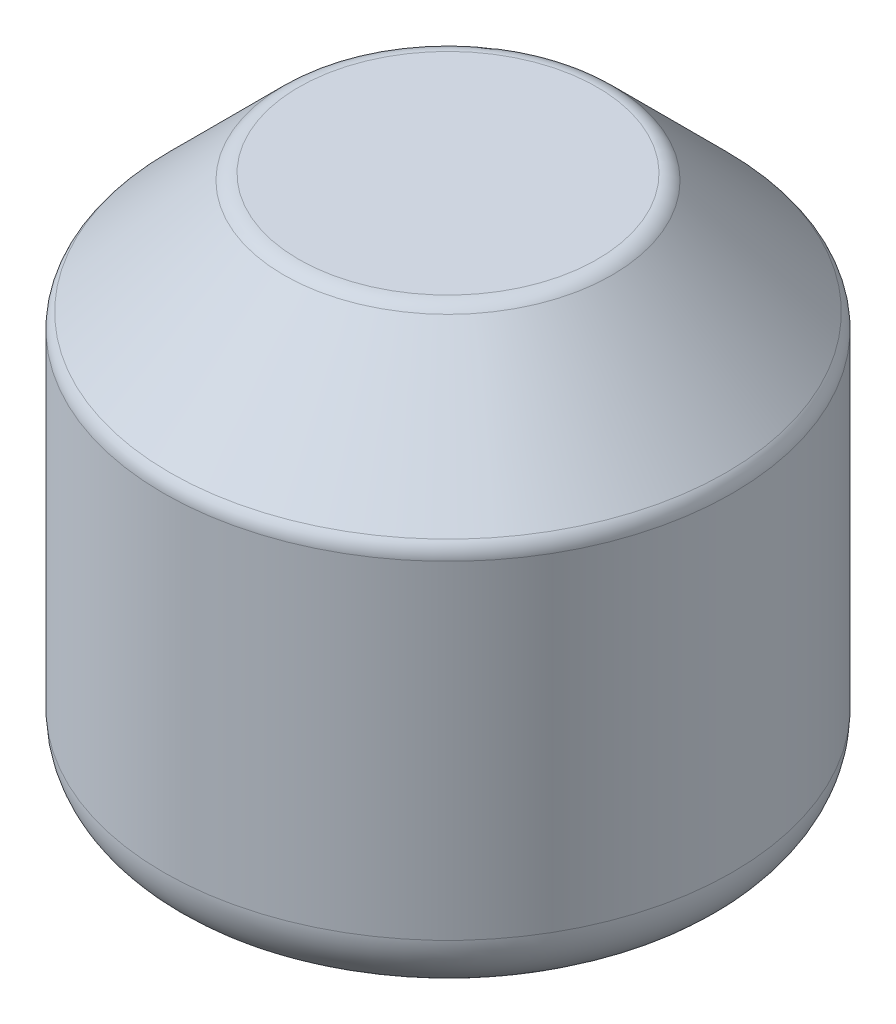
ISO-10303-21;
HEADER;
FILE_DESCRIPTION(('STEP AP214'),'2;1');
FILE_NAME('part.step','',(''),(''),'','','');
FILE_SCHEMA(('AUTOMOTIVE_DESIGN { 1 0 10303 214 1 1 1 1 }'));
ENDSEC;
DATA;
#1=APPLICATION_CONTEXT('core data for automotive mechanical design processes');
#2=APPLICATION_PROTOCOL_DEFINITION('international standard','automotive_design',2000,#1);
#3=PRODUCT_CONTEXT('',#1,'mechanical');
#4=PRODUCT('Part','Part','',(#3));
#5=PRODUCT_RELATED_PRODUCT_CATEGORY('part','',(#4));
#6=PRODUCT_DEFINITION_FORMATION('','',#4);
#7=PRODUCT_DEFINITION_CONTEXT('part definition',#1,'design');
#8=PRODUCT_DEFINITION('design','',#6,#7);
#9=PRODUCT_DEFINITION_SHAPE('','',#8);
#10=(LENGTH_UNIT() NAMED_UNIT(*) SI_UNIT(.MILLI.,.METRE.));
#11=(NAMED_UNIT(*) PLANE_ANGLE_UNIT() SI_UNIT($,.RADIAN.));
#12=(NAMED_UNIT(*) SI_UNIT($,.STERADIAN.) SOLID_ANGLE_UNIT());
#13=UNCERTAINTY_MEASURE_WITH_UNIT(LENGTH_MEASURE(1.E-05),#10,'distance_accuracy_value','');
#14=(GEOMETRIC_REPRESENTATION_CONTEXT(3) GLOBAL_UNCERTAINTY_ASSIGNED_CONTEXT((#13)) GLOBAL_UNIT_ASSIGNED_CONTEXT((#10,
#11,#12)) REPRESENTATION_CONTEXT('',''));
#15=CARTESIAN_POINT('',(0.,0.,0.));
#16=DIRECTION('',(0.,0.,1.));
#17=DIRECTION('',(1.,0.,0.));
#18=AXIS2_PLACEMENT_3D('',#15,#16,#17);
#19=CARTESIAN_POINT('',(0.,25.,0.));
#20=DIRECTION('',(0.,-1.,0.));
#21=DIRECTION('',(0.,0.,-1.));
#22=AXIS2_PLACEMENT_3D('',#19,#20,#21);
#23=CYLINDRICAL_SURFACE('',#22,13.5);
#24=CARTESIAN_POINT('',(0.,18.5857864376269,0.));
#25=DIRECTION('',(0.,1.,0.));
#26=DIRECTION('',(0.,0.,1.));
#27=AXIS2_PLACEMENT_3D('',#24,#25,#26);
#28=CIRCLE('',#27,13.5);
#29=CARTESIAN_POINT('',(0.,18.5857864376269,13.5));
#30=VERTEX_POINT('',#29);
#31=EDGE_CURVE('E10',#30,#30,#28,.F.);
#32=ORIENTED_EDGE('',*,*,#31,.T.);
#33=EDGE_LOOP('',(#32));
#34=FACE_BOUND('',#33,.T.);
#35=CARTESIAN_POINT('',(0.,3.,0.));
#36=DIRECTION('',(0.,1.,0.));
#37=DIRECTION('',(0.,0.,1.));
#38=AXIS2_PLACEMENT_3D('',#35,#36,#37);
#39=CIRCLE('',#38,13.5);
#40=CARTESIAN_POINT('',(0.,3.,13.5));
#41=VERTEX_POINT('',#40);
#42=EDGE_CURVE('E57',#41,#41,#39,.T.);
#43=ORIENTED_EDGE('',*,*,#42,.T.);
#44=EDGE_LOOP('',(#43));
#45=FACE_BOUND('',#44,.T.);
#46=ADVANCED_FACE('F34',(#34,#45),#23,.T.);
#47=CARTESIAN_POINT('',(0.,25.,0.));
#48=DIRECTION('',(0.,1.,0.));
#49=DIRECTION('',(0.,0.,1.));
#50=AXIS2_PLACEMENT_3D('',#47,#48,#49);
#51=PLANE('',#50);
#52=CARTESIAN_POINT('',(0.,25.,0.));
#53=DIRECTION('',(0.,1.,0.));
#54=DIRECTION('',(0.,0.,1.));
#55=AXIS2_PLACEMENT_3D('',#52,#53,#54);
#56=CIRCLE('',#55,7.08578643762691);
#57=CARTESIAN_POINT('',(0.,25.,7.08578643762691));
#58=VERTEX_POINT('',#57);
#59=EDGE_CURVE('E49',#58,#58,#56,.T.);
#60=ORIENTED_EDGE('',*,*,#59,.T.);
#61=EDGE_LOOP('',(#60));
#62=FACE_BOUND('',#61,.T.);
#63=ADVANCED_FACE('F77',(#62),#51,.T.);
#64=CARTESIAN_POINT('',(0.,0.,0.));
#65=DIRECTION('',(0.,1.,0.));
#66=DIRECTION('',(0.,0.,1.));
#67=AXIS2_PLACEMENT_3D('',#64,#65,#66);
#68=PLANE('',#67);
#69=CARTESIAN_POINT('',(0.,0.,0.));
#70=DIRECTION('',(0.,1.,0.));
#71=DIRECTION('',(0.,0.,1.));
#72=AXIS2_PLACEMENT_3D('',#69,#70,#71);
#73=CIRCLE('',#72,10.5);
#74=CARTESIAN_POINT('',(0.,0.,10.5));
#75=VERTEX_POINT('',#74);
#76=EDGE_CURVE('E54',#75,#75,#73,.F.);
#77=ORIENTED_EDGE('',*,*,#76,.T.);
#78=EDGE_LOOP('',(#77));
#79=FACE_BOUND('',#78,.T.);
#80=ADVANCED_FACE('F73',(#79),#68,.F.);
#81=CARTESIAN_POINT('',(0.,25.,0.));
#82=DIRECTION('',(0.,-1.,0.));
#83=DIRECTION('',(0.,0.,-1.));
#84=AXIS2_PLACEMENT_3D('',#81,#82,#83);
#85=CONICAL_SURFACE('',#84,7.50000000000001,0.785398163397447);
#86=CARTESIAN_POINT('',(0.,24.7071067811865,0.));
#87=DIRECTION('',(0.,1.,0.));
#88=DIRECTION('',(0.,0.,1.));
#89=AXIS2_PLACEMENT_3D('',#86,#87,#88);
#90=CIRCLE('',#89,7.79289321881346);
#91=CARTESIAN_POINT('',(0.,24.7071067811865,-7.79289321881346));
#92=VERTEX_POINT('',#91);
#93=EDGE_CURVE('E41',#92,#92,#90,.F.);
#94=CARTESIAN_POINT('',(0.,19.2928932188134,0.));
#95=DIRECTION('',(0.,-1.,0.));
#96=DIRECTION('',(0.,0.,-1.));
#97=AXIS2_PLACEMENT_3D('',#94,#95,#96);
#98=CIRCLE('',#97,13.2071067811865);
#99=CARTESIAN_POINT('',(0.,19.2928932188134,-13.2071067811865));
#100=VERTEX_POINT('',#99);
#101=EDGE_CURVE('E45',#100,#100,#98,.F.);
#102=CARTESIAN_POINT('',(0.,24.7071067811865,-7.79289321881346));
#103=CARTESIAN_POINT('',(0.,24.6507087232452,-7.84929127675485));
#104=CARTESIAN_POINT('',(0.,24.5943106653038,-7.90568933469623));
#105=CARTESIAN_POINT('',(0.,24.481514549421,-8.01848545057901));
#106=CARTESIAN_POINT('',(0.,24.4251164914796,-8.07488350852039));
#107=CARTESIAN_POINT('',(0.,24.3123203755968,-8.18767962440317));
#108=CARTESIAN_POINT('',(0.,24.2559223176555,-8.24407768234455));
#109=CARTESIAN_POINT('',(0.,24.1431262017727,-8.35687379822732));
#110=CARTESIAN_POINT('',(0.,24.0867281438313,-8.41327185616871));
#111=CARTESIAN_POINT('',(0.,23.9739320279485,-8.52606797205148));
#112=CARTESIAN_POINT('',(0.,23.9175339700071,-8.58246602999287));
#113=CARTESIAN_POINT('',(0.,23.8047378541244,-8.69526214587564));
#114=CARTESIAN_POINT('',(0.,23.748339796183,-8.75166020381703));
#115=CARTESIAN_POINT('',(0.,23.6355436803002,-8.8644563196998));
#116=CARTESIAN_POINT('',(0.,23.5791456223588,-8.92085437764119));
#117=CARTESIAN_POINT('',(0.,23.466349506476,-9.03365049352396));
#118=CARTESIAN_POINT('',(0.,23.4099514485347,-9.09004855146535));
#119=CARTESIAN_POINT('',(0.,23.2971553326519,-9.20284466734812));
#120=CARTESIAN_POINT('',(0.,23.2407572747105,-9.25924272528951));
#121=CARTESIAN_POINT('',(0.,23.1279611588277,-9.37203884117228));
#122=CARTESIAN_POINT('',(0.,23.0715631008863,-9.42843689911366));
#123=CARTESIAN_POINT('',(0.,22.9587669850036,-9.54123301499644));
#124=CARTESIAN_POINT('',(0.,22.9023689270622,-9.59763107293782));
#125=CARTESIAN_POINT('',(0.,22.7895728111794,-9.7104271888206));
#126=CARTESIAN_POINT('',(0.,22.733174753238,-9.76682524676198));
#127=CARTESIAN_POINT('',(0.,22.6203786373552,-9.87962136264476));
#128=CARTESIAN_POINT('',(0.,22.5639805794139,-9.93601942058614));
#129=CARTESIAN_POINT('',(0.,22.4511844635311,-10.0488155364689));
#130=CARTESIAN_POINT('',(0.,22.3947864055897,-10.1052135944103));
#131=CARTESIAN_POINT('',(0.,22.2819902897069,-10.2180097102931));
#132=CARTESIAN_POINT('',(0.,22.2255922317655,-10.2744077682345));
#133=CARTESIAN_POINT('',(0.,22.1127961158828,-10.3872038841172));
#134=CARTESIAN_POINT('',(0.,22.0563980579414,-10.4436019420586));
#135=CARTESIAN_POINT('',(0.,21.9436019420586,-10.5563980579414));
#136=CARTESIAN_POINT('',(0.,21.8872038841172,-10.6127961158828));
#137=CARTESIAN_POINT('',(0.,21.7744077682344,-10.7255922317656));
#138=CARTESIAN_POINT('',(0.,21.7180097102931,-10.7819902897069));
#139=CARTESIAN_POINT('',(0.,21.6052135944103,-10.8947864055897));
#140=CARTESIAN_POINT('',(0.,21.5488155364689,-10.9511844635311));
#141=CARTESIAN_POINT('',(0.,21.4360194205861,-11.0639805794139));
#142=CARTESIAN_POINT('',(0.,21.3796213626447,-11.1203786373553));
#143=CARTESIAN_POINT('',(0.,21.266825246762,-11.233174753238));
#144=CARTESIAN_POINT('',(0.,21.2104271888206,-11.2895728111794));
#145=CARTESIAN_POINT('',(0.,21.0976310729378,-11.4023689270622));
#146=CARTESIAN_POINT('',(0.,21.0412330149964,-11.4587669850036));
#147=CARTESIAN_POINT('',(0.,20.9284368991136,-11.5715631008863));
#148=CARTESIAN_POINT('',(0.,20.8720388411723,-11.6279611588277));
#149=CARTESIAN_POINT('',(0.,20.7592427252895,-11.7407572747105));
#150=CARTESIAN_POINT('',(0.,20.7028446673481,-11.7971553326519));
#151=CARTESIAN_POINT('',(0.,20.5900485514653,-11.9099514485347));
#152=CARTESIAN_POINT('',(0.,20.5336504935239,-11.966349506476));
#153=CARTESIAN_POINT('',(0.,20.4208543776412,-12.0791456223588));
#154=CARTESIAN_POINT('',(0.,20.3644563196998,-12.1355436803002));
#155=CARTESIAN_POINT('',(0.,20.251660203817,-12.248339796183));
#156=CARTESIAN_POINT('',(0.,20.1952621458756,-12.3047378541244));
#157=CARTESIAN_POINT('',(0.,20.0824660299929,-12.4175339700071));
#158=CARTESIAN_POINT('',(0.,20.0260679720515,-12.4739320279485));
#159=CARTESIAN_POINT('',(0.,19.9132718561687,-12.5867281438313));
#160=CARTESIAN_POINT('',(0.,19.8568737982273,-12.6431262017727));
#161=CARTESIAN_POINT('',(0.,19.7440776823445,-12.7559223176555));
#162=CARTESIAN_POINT('',(0.,19.6876796244031,-12.8123203755968));
#163=CARTESIAN_POINT('',(0.,19.5748835085204,-12.9251164914796));
#164=CARTESIAN_POINT('',(0.,19.518485450579,-12.981514549421));
#165=CARTESIAN_POINT('',(0.,19.4056893346962,-13.0943106653038));
#166=CARTESIAN_POINT('',(0.,19.3492912767548,-13.1507087232452));
#167=CARTESIAN_POINT('',(0.,19.2928932188134,-13.2071067811865));
#168=B_SPLINE_CURVE_WITH_KNOTS('',3,(#102,#103,#104,#105,#106,#107,#108,#109,#110,#111,#112,
#113,#114,#115,#116,#117,#118,#119,#120,#121,#122,#123,#124,#125,#126,#127,#128,#129,#130,#131,
#132,#133,#134,#135,#136,#137,#138,#139,#140,#141,#142,#143,#144,#145,#146,#147,#148,#149,#150,
#151,#152,#153,#154,#155,#156,#157,#158,#159,#160,#161,#162,#163,#164,#165,#166,#167),
.UNSPECIFIED.,.F.,.F.,(4,2,2,2,2,2,2,2,2,2,2,2,2,2,2,2,2,2,2,2,2,2,2,2,2,2,2,2,2,2,2,2,4),(0.,
0.239276695296635,0.478553390593273,0.717830085889909,0.957106781186547,1.19638347648318,
1.43566017177982,1.67493686707646,1.91421356237309,2.15349025766973,2.39276695296637,
2.632043648263,2.87132034355964,3.11059703885628,3.34987373415292,3.58915042944955,
3.82842712474619,4.06770382004283,4.30698051533946,4.5462572106361,4.78553390593274,
5.02481060122937,5.26408729652601,5.50336399182265,5.74264068711928,5.98191738241592,
6.22119407771256,6.4604707730092,6.69974746830583,6.93902416360247,7.17830085889911,
7.41757755419575,7.65685424949238),.UNSPECIFIED.);
#169=EDGE_CURVE('BSEAM65',#92,#100,#168,.T.);
#170=ORIENTED_EDGE('',*,*,#93,.T.);
#171=ORIENTED_EDGE('',*,*,#101,.T.);
#172=ORIENTED_EDGE('',*,*,#169,.T.);
#173=ORIENTED_EDGE('',*,*,#169,.F.);
#174=EDGE_LOOP('',(#170,#172,#171,#173));
#175=FACE_BOUND('',#174,.T.);
#176=ADVANCED_FACE('F65',(#175),#85,.T.);
#177=CARTESIAN_POINT('',(0.,3.,0.));
#178=DIRECTION('',(0.,1.,0.));
#179=DIRECTION('',(0.,0.,1.));
#180=AXIS2_PLACEMENT_3D('',#177,#178,#179);
#181=TOROIDAL_SURFACE('',#180,10.5,3.);
#182=ORIENTED_EDGE('',*,*,#76,.F.);
#183=EDGE_LOOP('',(#182));
#184=FACE_BOUND('',#183,.T.);
#185=ORIENTED_EDGE('',*,*,#42,.F.);
#186=EDGE_LOOP('',(#185));
#187=FACE_BOUND('',#186,.T.);
#188=ADVANCED_FACE('F62',(#184,#187),#181,.T.);
#189=CARTESIAN_POINT('',(0.,24.,0.));
#190=DIRECTION('',(0.,1.,0.));
#191=DIRECTION('',(0.,0.,1.));
#192=AXIS2_PLACEMENT_3D('',#189,#190,#191);
#193=TOROIDAL_SURFACE('',#192,7.08578643762691,1.);
#194=ORIENTED_EDGE('',*,*,#93,.F.);
#195=EDGE_LOOP('',(#194));
#196=FACE_BOUND('',#195,.T.);
#197=ORIENTED_EDGE('',*,*,#59,.F.);
#198=EDGE_LOOP('',(#197));
#199=FACE_BOUND('',#198,.T.);
#200=ADVANCED_FACE('F64',(#196,#199),#193,.T.);
#201=CARTESIAN_POINT('',(0.,18.5857864376269,0.));
#202=DIRECTION('',(0.,1.,0.));
#203=DIRECTION('',(0.,0.,1.));
#204=AXIS2_PLACEMENT_3D('',#201,#202,#203);
#205=TOROIDAL_SURFACE('',#204,12.5,1.);
#206=ORIENTED_EDGE('',*,*,#101,.F.);
#207=EDGE_LOOP('',(#206));
#208=FACE_BOUND('',#207,.T.);
#209=ORIENTED_EDGE('',*,*,#31,.F.);
#210=EDGE_LOOP('',(#209));
#211=FACE_BOUND('',#210,.T.);
#212=ADVANCED_FACE('F36',(#208,#211),#205,.T.);
#213=CLOSED_SHELL('',(#46,#63,#80,#176,#188,#200,#212));
#214=MANIFOLD_SOLID_BREP('B2',#213);
#215=ADVANCED_BREP_SHAPE_REPRESENTATION('',(#18,#214),#14);
#216=SHAPE_DEFINITION_REPRESENTATION(#9,#215);
ENDSEC;
END-ISO-10303-21;
